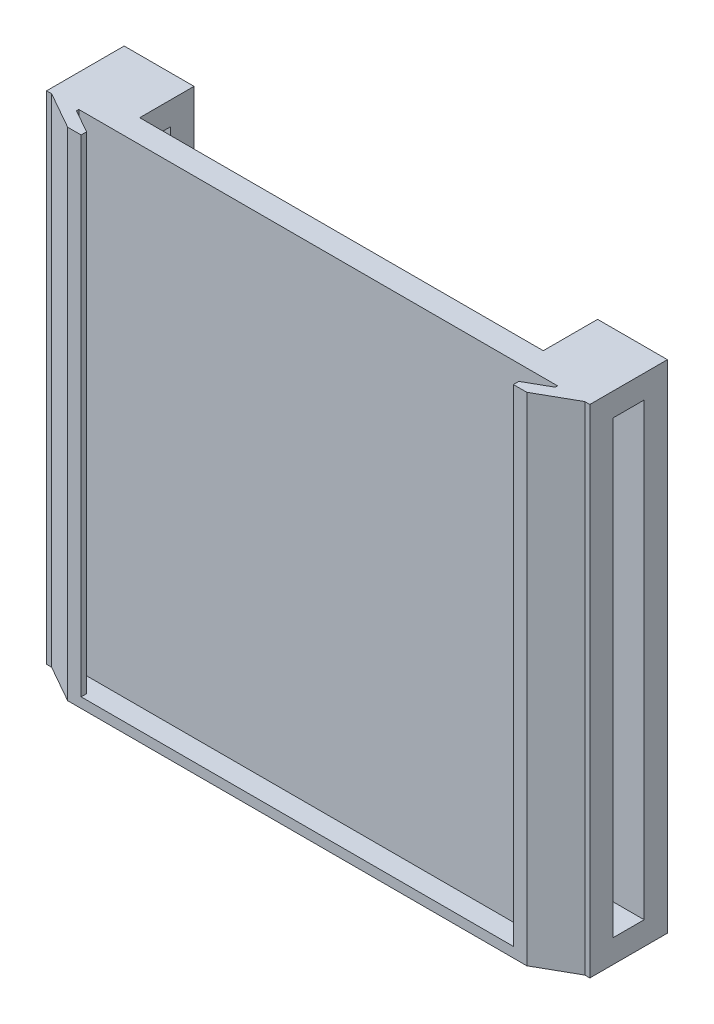
ISO-10303-21;
HEADER;
FILE_DESCRIPTION(('STEP AP214'),'2;1');
FILE_NAME('part.step','',(''),(''),'','','');
FILE_SCHEMA(('AUTOMOTIVE_DESIGN { 1 0 10303 214 1 1 1 1 }'));
ENDSEC;
DATA;
#1=APPLICATION_CONTEXT('core data for automotive mechanical design processes');
#2=APPLICATION_PROTOCOL_DEFINITION('international standard','automotive_design',2000,#1);
#3=PRODUCT_CONTEXT('',#1,'mechanical');
#4=PRODUCT('Part','Part','',(#3));
#5=PRODUCT_RELATED_PRODUCT_CATEGORY('part','',(#4));
#6=PRODUCT_DEFINITION_FORMATION('','',#4);
#7=PRODUCT_DEFINITION_CONTEXT('part definition',#1,'design');
#8=PRODUCT_DEFINITION('design','',#6,#7);
#9=PRODUCT_DEFINITION_SHAPE('','',#8);
#10=(LENGTH_UNIT() NAMED_UNIT(*) SI_UNIT(.MILLI.,.METRE.));
#11=(NAMED_UNIT(*) PLANE_ANGLE_UNIT() SI_UNIT($,.RADIAN.));
#12=(NAMED_UNIT(*) SI_UNIT($,.STERADIAN.) SOLID_ANGLE_UNIT());
#13=UNCERTAINTY_MEASURE_WITH_UNIT(LENGTH_MEASURE(1.E-05),#10,'distance_accuracy_value','');
#14=(GEOMETRIC_REPRESENTATION_CONTEXT(3) GLOBAL_UNCERTAINTY_ASSIGNED_CONTEXT((#13)) GLOBAL_UNIT_ASSIGNED_CONTEXT((#10,
#11,#12)) REPRESENTATION_CONTEXT('',''));
#15=CARTESIAN_POINT('',(0.,0.,0.));
#16=DIRECTION('',(0.,0.,1.));
#17=DIRECTION('',(1.,0.,0.));
#18=AXIS2_PLACEMENT_3D('',#15,#16,#17);
#19=CARTESIAN_POINT('',(0.,0.,0.));
#20=DIRECTION('',(0.,0.,1.));
#21=DIRECTION('',(1.,0.,0.));
#22=AXIS2_PLACEMENT_3D('',#19,#20,#21);
#23=PLANE('',#22);
#24=DIRECTION('',(-1.,0.,0.));
#25=VECTOR('',#24,1.);
#26=CARTESIAN_POINT('',(-35.,32.,0.));
#27=LINE('',#26,#25);
#28=CARTESIAN_POINT('',(-26.,32.,0.));
#29=VERTEX_POINT('',#28);
#30=CARTESIAN_POINT('',(-35.,32.,0.));
#31=VERTEX_POINT('',#30);
#32=EDGE_CURVE('E491',#29,#31,#27,.T.);
#33=ORIENTED_EDGE('',*,*,#32,.F.);
#34=DIRECTION('',(0.,1.,0.));
#35=VECTOR('',#34,1.);
#36=CARTESIAN_POINT('',(-26.,-32.,0.));
#37=LINE('',#36,#35);
#38=CARTESIAN_POINT('',(-26.,-32.,0.));
#39=VERTEX_POINT('',#38);
#40=EDGE_CURVE('E328',#39,#29,#37,.T.);
#41=ORIENTED_EDGE('',*,*,#40,.F.);
#42=DIRECTION('',(1.,0.,0.));
#43=VECTOR('',#42,1.);
#44=CARTESIAN_POINT('',(-35.,-32.,0.));
#45=LINE('',#44,#43);
#46=CARTESIAN_POINT('',(-35.,-32.,0.));
#47=VERTEX_POINT('',#46);
#48=EDGE_CURVE('E484',#47,#39,#45,.T.);
#49=ORIENTED_EDGE('',*,*,#48,.F.);
#50=DIRECTION('',(0.,-1.,0.));
#51=VECTOR('',#50,1.);
#52=CARTESIAN_POINT('',(-35.,32.,0.));
#53=LINE('',#52,#51);
#54=EDGE_CURVE('E446',#31,#47,#53,.T.);
#55=ORIENTED_EDGE('',*,*,#54,.F.);
#56=EDGE_LOOP('',(#33,#41,#49,#55));
#57=FACE_BOUND('',#56,.T.);
#58=ADVANCED_FACE('F43',(#57),#23,.F.);
#59=CARTESIAN_POINT('',(0.,0.,10.));
#60=DIRECTION('',(0.,0.,1.));
#61=DIRECTION('',(1.,0.,0.));
#62=AXIS2_PLACEMENT_3D('',#59,#60,#61);
#63=PLANE('',#62);
#64=DIRECTION('',(1.,0.,0.));
#65=VECTOR('',#64,1.);
#66=CARTESIAN_POINT('',(-35.,-32.,10.));
#67=LINE('',#66,#65);
#68=CARTESIAN_POINT('',(-35.,-32.,10.));
#69=VERTEX_POINT('',#68);
#70=CARTESIAN_POINT('',(-34.34617358,-32.,10.));
#71=VERTEX_POINT('',#70);
#72=EDGE_CURVE('E467',#69,#71,#67,.T.);
#73=ORIENTED_EDGE('',*,*,#72,.T.);
#74=DIRECTION('',(0.,1.,0.));
#75=VECTOR('',#74,1.);
#76=CARTESIAN_POINT('',(-34.34617358,-32.,10.));
#77=LINE('',#76,#75);
#78=CARTESIAN_POINT('',(-34.34617358,32.,10.));
#79=VERTEX_POINT('',#78);
#80=EDGE_CURVE('E396',#71,#79,#77,.T.);
#81=ORIENTED_EDGE('',*,*,#80,.T.);
#82=DIRECTION('',(-1.,0.,0.));
#83=VECTOR('',#82,1.);
#84=CARTESIAN_POINT('',(-35.,32.,10.));
#85=LINE('',#84,#83);
#86=CARTESIAN_POINT('',(-35.,32.,10.));
#87=VERTEX_POINT('',#86);
#88=EDGE_CURVE('E473',#79,#87,#85,.T.);
#89=ORIENTED_EDGE('',*,*,#88,.T.);
#90=DIRECTION('',(0.,-1.,0.));
#91=VECTOR('',#90,1.);
#92=CARTESIAN_POINT('',(-35.,32.,10.));
#93=LINE('',#92,#91);
#94=EDGE_CURVE('E461',#87,#69,#93,.T.);
#95=ORIENTED_EDGE('',*,*,#94,.T.);
#96=EDGE_LOOP('',(#73,#81,#89,#95));
#97=FACE_BOUND('',#96,.T.);
#98=ADVANCED_FACE('F559',(#97),#63,.T.);
#99=DIRECTION('',(1.,0.,0.));
#100=VECTOR('',#99,1.);
#101=CARTESIAN_POINT('',(-30.84617358,-30.7,10.));
#102=LINE('',#101,#100);
#103=CARTESIAN_POINT('',(-30.84617358,-30.7,10.));
#104=VERTEX_POINT('',#103);
#105=CARTESIAN_POINT('',(30.84617358,-30.7,10.));
#106=VERTEX_POINT('',#105);
#107=EDGE_CURVE('E362',#104,#106,#102,.T.);
#108=ORIENTED_EDGE('',*,*,#107,.T.);
#109=DIRECTION('',(0.,1.,0.));
#110=VECTOR('',#109,1.);
#111=CARTESIAN_POINT('',(30.84617358,-32.,10.));
#112=LINE('',#111,#110);
#113=CARTESIAN_POINT('',(30.84617358,32.,10.));
#114=VERTEX_POINT('',#113);
#115=EDGE_CURVE('E456',#106,#114,#112,.T.);
#116=ORIENTED_EDGE('',*,*,#115,.T.);
#117=CARTESIAN_POINT('',(-30.84617358,32.,10.));
#118=VERTEX_POINT('',#117);
#119=EDGE_CURVE('E479',#114,#118,#85,.T.);
#120=ORIENTED_EDGE('',*,*,#119,.T.);
#121=DIRECTION('',(0.,1.,0.));
#122=VECTOR('',#121,1.);
#123=CARTESIAN_POINT('',(-30.84617358,-32.,10.));
#124=LINE('',#123,#122);
#125=EDGE_CURVE('E401',#104,#118,#124,.T.);
#126=ORIENTED_EDGE('',*,*,#125,.F.);
#127=EDGE_LOOP('',(#108,#116,#120,#126));
#128=FACE_BOUND('',#127,.T.);
#129=ADVANCED_FACE('F565',(#128),#63,.T.);
#130=CARTESIAN_POINT('',(-35.,32.,10.));
#131=DIRECTION('',(1.,0.,0.));
#132=DIRECTION('',(0.,1.,0.));
#133=AXIS2_PLACEMENT_3D('',#130,#131,#132);
#134=PLANE('',#133);
#135=DIRECTION('',(0.,0.,-1.));
#136=VECTOR('',#135,1.);
#137=CARTESIAN_POINT('',(-35.,-29.,2.99999999999999));
#138=LINE('',#137,#136);
#139=CARTESIAN_POINT('',(-35.,-29.,6.99999999999999));
#140=VERTEX_POINT('',#139);
#141=CARTESIAN_POINT('',(-35.,-29.,2.99999999999999));
#142=VERTEX_POINT('',#141);
#143=EDGE_CURVE('E255',#140,#142,#138,.T.);
#144=ORIENTED_EDGE('',*,*,#143,.T.);
#145=DIRECTION('',(0.,1.,0.));
#146=VECTOR('',#145,1.);
#147=CARTESIAN_POINT('',(-35.,29.,3.));
#148=LINE('',#147,#146);
#149=CARTESIAN_POINT('',(-35.,29.,3.));
#150=VERTEX_POINT('',#149);
#151=EDGE_CURVE('E236',#142,#150,#148,.T.);
#152=ORIENTED_EDGE('',*,*,#151,.T.);
#153=DIRECTION('',(0.,0.,1.));
#154=VECTOR('',#153,1.);
#155=CARTESIAN_POINT('',(-35.,29.,3.));
#156=LINE('',#155,#154);
#157=CARTESIAN_POINT('',(-35.,29.,7.));
#158=VERTEX_POINT('',#157);
#159=EDGE_CURVE('E247',#150,#158,#156,.T.);
#160=ORIENTED_EDGE('',*,*,#159,.T.);
#161=DIRECTION('',(0.,-1.,0.));
#162=VECTOR('',#161,1.);
#163=CARTESIAN_POINT('',(-35.,29.,7.));
#164=LINE('',#163,#162);
#165=EDGE_CURVE('E59',#158,#140,#164,.T.);
#166=ORIENTED_EDGE('',*,*,#165,.T.);
#167=EDGE_LOOP('',(#144,#152,#160,#166));
#168=FACE_BOUND('',#167,.T.);
#169=ORIENTED_EDGE('',*,*,#54,.T.);
#170=DIRECTION('',(0.,0.,-1.));
#171=VECTOR('',#170,1.);
#172=CARTESIAN_POINT('',(-35.,-32.,10.));
#173=LINE('',#172,#171);
#174=EDGE_CURVE('E52',#69,#47,#173,.T.);
#175=ORIENTED_EDGE('',*,*,#174,.F.);
#176=ORIENTED_EDGE('',*,*,#94,.F.);
#177=DIRECTION('',(0.,0.,-1.));
#178=VECTOR('',#177,1.);
#179=CARTESIAN_POINT('',(-35.,32.,10.));
#180=LINE('',#179,#178);
#181=EDGE_CURVE('E478',#87,#31,#180,.T.);
#182=ORIENTED_EDGE('',*,*,#181,.T.);
#183=EDGE_LOOP('',(#169,#175,#176,#182));
#184=FACE_BOUND('',#183,.T.);
#185=ADVANCED_FACE('F45',(#168,#184),#134,.F.);
#186=CARTESIAN_POINT('',(-35.,-32.,10.));
#187=DIRECTION('',(0.,1.,0.));
#188=DIRECTION('',(0.,0.,1.));
#189=AXIS2_PLACEMENT_3D('',#186,#187,#188);
#190=PLANE('',#189);
#191=ORIENTED_EDGE('',*,*,#48,.T.);
#192=DIRECTION('',(0.,0.,1.));
#193=VECTOR('',#192,1.);
#194=CARTESIAN_POINT('',(-26.,-32.,0.));
#195=LINE('',#194,#193);
#196=CARTESIAN_POINT('',(-26.,-32.,7.));
#197=VERTEX_POINT('',#196);
#198=EDGE_CURVE('E305',#39,#197,#195,.T.);
#199=ORIENTED_EDGE('',*,*,#198,.T.);
#200=DIRECTION('',(1.,0.,0.));
#201=VECTOR('',#200,1.);
#202=CARTESIAN_POINT('',(-26.,-32.,7.));
#203=LINE('',#202,#201);
#204=CARTESIAN_POINT('',(26.,-32.,7.));
#205=VERTEX_POINT('',#204);
#206=EDGE_CURVE('E309',#197,#205,#203,.T.);
#207=ORIENTED_EDGE('',*,*,#206,.T.);
#208=DIRECTION('',(0.,0.,-1.));
#209=VECTOR('',#208,1.);
#210=CARTESIAN_POINT('',(26.,-32.,0.));
#211=LINE('',#210,#209);
#212=CARTESIAN_POINT('',(26.,-32.,0.));
#213=VERTEX_POINT('',#212);
#214=EDGE_CURVE('E314',#205,#213,#211,.T.);
#215=ORIENTED_EDGE('',*,*,#214,.T.);
#216=CARTESIAN_POINT('',(35.,-32.,0.));
#217=VERTEX_POINT('',#216);
#218=EDGE_CURVE('E483',#213,#217,#45,.T.);
#219=ORIENTED_EDGE('',*,*,#218,.T.);
#220=DIRECTION('',(0.,0.,-1.));
#221=VECTOR('',#220,1.);
#222=CARTESIAN_POINT('',(35.,-32.,10.));
#223=LINE('',#222,#221);
#224=CARTESIAN_POINT('',(35.,-32.,10.));
#225=VERTEX_POINT('',#224);
#226=EDGE_CURVE('E502',#225,#217,#223,.T.);
#227=ORIENTED_EDGE('',*,*,#226,.F.);
#228=CARTESIAN_POINT('',(34.34617358,-32.,10.));
#229=VERTEX_POINT('',#228);
#230=EDGE_CURVE('E465',#229,#225,#67,.T.);
#231=ORIENTED_EDGE('',*,*,#230,.F.);
#232=DIRECTION('',(0.870022185848613,0.,-0.49301257198088));
#233=VECTOR('',#232,1.);
#234=CARTESIAN_POINT('',(29.5814676976471,-32.,12.7));
#235=LINE('',#234,#233);
#236=CARTESIAN_POINT('',(29.5814676976471,-32.,12.7));
#237=VERTEX_POINT('',#236);
#238=EDGE_CURVE('E416',#237,#229,#235,.T.);
#239=ORIENTED_EDGE('',*,*,#238,.F.);
#240=DIRECTION('',(1.,0.,0.));
#241=VECTOR('',#240,1.);
#242=CARTESIAN_POINT('',(27.84617358,-32.,12.7));
#243=LINE('',#242,#241);
#244=CARTESIAN_POINT('',(-29.5814676976471,-32.,12.7));
#245=VERTEX_POINT('',#244);
#246=EDGE_CURVE('E419',#245,#237,#243,.T.);
#247=ORIENTED_EDGE('',*,*,#246,.F.);
#248=DIRECTION('',(-0.870022185848613,0.,-0.49301257198088));
#249=VECTOR('',#248,1.);
#250=CARTESIAN_POINT('',(-29.5814676976471,-32.,12.7));
#251=LINE('',#250,#249);
#252=EDGE_CURVE('E373',#245,#71,#251,.T.);
#253=ORIENTED_EDGE('',*,*,#252,.T.);
#254=ORIENTED_EDGE('',*,*,#72,.F.);
#255=ORIENTED_EDGE('',*,*,#174,.T.);
#256=EDGE_LOOP('',(#191,#199,#207,#215,#219,#227,#231,#239,#247,#253,#254,#255));
#257=FACE_BOUND('',#256,.T.);
#258=ADVANCED_FACE('F509',(#257),#190,.F.);
#259=CARTESIAN_POINT('',(35.,32.,10.));
#260=DIRECTION('',(-1.,0.,0.));
#261=DIRECTION('',(0.,-1.,0.));
#262=AXIS2_PLACEMENT_3D('',#259,#260,#261);
#263=PLANE('',#262);
#264=DIRECTION('',(0.,0.,1.));
#265=VECTOR('',#264,1.);
#266=CARTESIAN_POINT('',(35.,29.,3.));
#267=LINE('',#266,#265);
#268=CARTESIAN_POINT('',(35.,29.,3.));
#269=VERTEX_POINT('',#268);
#270=CARTESIAN_POINT('',(35.,29.,7.));
#271=VERTEX_POINT('',#270);
#272=EDGE_CURVE('E270',#269,#271,#267,.T.);
#273=ORIENTED_EDGE('',*,*,#272,.F.);
#274=DIRECTION('',(0.,1.,0.));
#275=VECTOR('',#274,1.);
#276=CARTESIAN_POINT('',(35.,29.,3.));
#277=LINE('',#276,#275);
#278=CARTESIAN_POINT('',(35.,-29.,2.99999999999999));
#279=VERTEX_POINT('',#278);
#280=EDGE_CURVE('E67',#279,#269,#277,.T.);
#281=ORIENTED_EDGE('',*,*,#280,.F.);
#282=DIRECTION('',(0.,0.,-1.));
#283=VECTOR('',#282,1.);
#284=CARTESIAN_POINT('',(35.,-29.,2.99999999999999));
#285=LINE('',#284,#283);
#286=CARTESIAN_POINT('',(35.,-29.,6.99999999999999));
#287=VERTEX_POINT('',#286);
#288=EDGE_CURVE('E257',#287,#279,#285,.T.);
#289=ORIENTED_EDGE('',*,*,#288,.F.);
#290=DIRECTION('',(0.,-1.,0.));
#291=VECTOR('',#290,1.);
#292=CARTESIAN_POINT('',(35.,29.,7.));
#293=LINE('',#292,#291);
#294=EDGE_CURVE('E261',#271,#287,#293,.T.);
#295=ORIENTED_EDGE('',*,*,#294,.F.);
#296=EDGE_LOOP('',(#273,#281,#289,#295));
#297=FACE_BOUND('',#296,.T.);
#298=DIRECTION('',(0.,1.,0.));
#299=VECTOR('',#298,1.);
#300=CARTESIAN_POINT('',(35.,32.,0.));
#301=LINE('',#300,#299);
#302=CARTESIAN_POINT('',(35.,32.,0.));
#303=VERTEX_POINT('',#302);
#304=EDGE_CURVE('E488',#217,#303,#301,.T.);
#305=ORIENTED_EDGE('',*,*,#304,.T.);
#306=DIRECTION('',(0.,0.,-1.));
#307=VECTOR('',#306,1.);
#308=CARTESIAN_POINT('',(35.,32.,10.));
#309=LINE('',#308,#307);
#310=CARTESIAN_POINT('',(35.,32.,10.));
#311=VERTEX_POINT('',#310);
#312=EDGE_CURVE('E498',#311,#303,#309,.T.);
#313=ORIENTED_EDGE('',*,*,#312,.F.);
#314=DIRECTION('',(0.,1.,0.));
#315=VECTOR('',#314,1.);
#316=CARTESIAN_POINT('',(35.,32.,10.));
#317=LINE('',#316,#315);
#318=EDGE_CURVE('E470',#225,#311,#317,.T.);
#319=ORIENTED_EDGE('',*,*,#318,.F.);
#320=ORIENTED_EDGE('',*,*,#226,.T.);
#321=EDGE_LOOP('',(#305,#313,#319,#320));
#322=FACE_BOUND('',#321,.T.);
#323=ADVANCED_FACE('F537',(#297,#322),#263,.F.);
#324=CARTESIAN_POINT('',(-35.,32.,10.));
#325=DIRECTION('',(0.,-1.,0.));
#326=DIRECTION('',(0.,0.,-1.));
#327=AXIS2_PLACEMENT_3D('',#324,#325,#326);
#328=PLANE('',#327);
#329=DIRECTION('',(1.,0.,0.));
#330=VECTOR('',#329,1.);
#331=CARTESIAN_POINT('',(-26.,32.,7.));
#332=LINE('',#331,#330);
#333=CARTESIAN_POINT('',(-26.,32.,7.));
#334=VERTEX_POINT('',#333);
#335=CARTESIAN_POINT('',(26.,32.,7.));
#336=VERTEX_POINT('',#335);
#337=EDGE_CURVE('E322',#334,#336,#332,.T.);
#338=ORIENTED_EDGE('',*,*,#337,.F.);
#339=DIRECTION('',(0.,0.,1.));
#340=VECTOR('',#339,1.);
#341=CARTESIAN_POINT('',(-26.,32.,0.));
#342=LINE('',#341,#340);
#343=EDGE_CURVE('E304',#29,#334,#342,.T.);
#344=ORIENTED_EDGE('',*,*,#343,.F.);
#345=ORIENTED_EDGE('',*,*,#32,.T.);
#346=ORIENTED_EDGE('',*,*,#181,.F.);
#347=ORIENTED_EDGE('',*,*,#88,.F.);
#348=DIRECTION('',(-0.870022185848613,0.,-0.49301257198088));
#349=VECTOR('',#348,1.);
#350=CARTESIAN_POINT('',(-29.5814676976471,32.,12.7));
#351=LINE('',#350,#349);
#352=CARTESIAN_POINT('',(-29.5814676976471,32.,12.7));
#353=VERTEX_POINT('',#352);
#354=EDGE_CURVE('E372',#353,#79,#351,.T.);
#355=ORIENTED_EDGE('',*,*,#354,.F.);
#356=DIRECTION('',(-1.,0.,0.));
#357=VECTOR('',#356,1.);
#358=CARTESIAN_POINT('',(-27.84617358,32.,12.7));
#359=LINE('',#358,#357);
#360=CARTESIAN_POINT('',(-27.84617358,32.,12.7));
#361=VERTEX_POINT('',#360);
#362=EDGE_CURVE('E382',#361,#353,#359,.T.);
#363=ORIENTED_EDGE('',*,*,#362,.F.);
#364=DIRECTION('',(0.,0.,1.));
#365=VECTOR('',#364,1.);
#366=CARTESIAN_POINT('',(-27.84617358,32.,12.));
#367=LINE('',#366,#365);
#368=CARTESIAN_POINT('',(-27.84617358,32.,12.));
#369=VERTEX_POINT('',#368);
#370=EDGE_CURVE('E385',#369,#361,#367,.T.);
#371=ORIENTED_EDGE('',*,*,#370,.F.);
#372=DIRECTION('',(0.870022185848612,0.,0.49301257198088));
#373=VECTOR('',#372,1.);
#374=CARTESIAN_POINT('',(-27.84617358,32.,12.));
#375=LINE('',#374,#373);
#376=CARTESIAN_POINT('',(-30.84617358,32.,10.3));
#377=VERTEX_POINT('',#376);
#378=EDGE_CURVE('E389',#377,#369,#375,.T.);
#379=ORIENTED_EDGE('',*,*,#378,.F.);
#380=DIRECTION('',(0.,0.,1.));
#381=VECTOR('',#380,1.);
#382=CARTESIAN_POINT('',(-30.84617358,32.,10.3));
#383=LINE('',#382,#381);
#384=EDGE_CURVE('E378',#118,#377,#383,.T.);
#385=ORIENTED_EDGE('',*,*,#384,.F.);
#386=ORIENTED_EDGE('',*,*,#119,.F.);
#387=DIRECTION('',(0.,0.,1.));
#388=VECTOR('',#387,1.);
#389=CARTESIAN_POINT('',(30.84617358,32.,10.3));
#390=LINE('',#389,#388);
#391=CARTESIAN_POINT('',(30.84617358,32.,10.3));
#392=VERTEX_POINT('',#391);
#393=EDGE_CURVE('E428',#114,#392,#390,.T.);
#394=ORIENTED_EDGE('',*,*,#393,.T.);
#395=DIRECTION('',(-0.870022185848612,0.,0.49301257198088));
#396=VECTOR('',#395,1.);
#397=CARTESIAN_POINT('',(27.84617358,32.,12.));
#398=LINE('',#397,#396);
#399=CARTESIAN_POINT('',(27.84617358,32.,12.));
#400=VERTEX_POINT('',#399);
#401=EDGE_CURVE('E432',#392,#400,#398,.T.);
#402=ORIENTED_EDGE('',*,*,#401,.T.);
#403=DIRECTION('',(0.,0.,1.));
#404=VECTOR('',#403,1.);
#405=CARTESIAN_POINT('',(27.84617358,32.,12.));
#406=LINE('',#405,#404);
#407=CARTESIAN_POINT('',(27.84617358,32.,12.7));
#408=VERTEX_POINT('',#407);
#409=EDGE_CURVE('E436',#400,#408,#406,.T.);
#410=ORIENTED_EDGE('',*,*,#409,.T.);
#411=DIRECTION('',(1.,0.,0.));
#412=VECTOR('',#411,1.);
#413=CARTESIAN_POINT('',(27.84617358,32.,12.7));
#414=LINE('',#413,#412);
#415=CARTESIAN_POINT('',(29.5814676976471,32.,12.7));
#416=VERTEX_POINT('',#415);
#417=EDGE_CURVE('E420',#408,#416,#414,.T.);
#418=ORIENTED_EDGE('',*,*,#417,.T.);
#419=DIRECTION('',(0.870022185848613,0.,-0.49301257198088));
#420=VECTOR('',#419,1.);
#421=CARTESIAN_POINT('',(29.5814676976471,32.,12.7));
#422=LINE('',#421,#420);
#423=CARTESIAN_POINT('',(34.34617358,32.,10.));
#424=VERTEX_POINT('',#423);
#425=EDGE_CURVE('E400',#416,#424,#422,.T.);
#426=ORIENTED_EDGE('',*,*,#425,.T.);
#427=EDGE_CURVE('E474',#311,#424,#85,.T.);
#428=ORIENTED_EDGE('',*,*,#427,.F.);
#429=ORIENTED_EDGE('',*,*,#312,.T.);
#430=CARTESIAN_POINT('',(26.,32.,0.));
#431=VERTEX_POINT('',#430);
#432=EDGE_CURVE('E466',#303,#431,#27,.T.);
#433=ORIENTED_EDGE('',*,*,#432,.T.);
#434=DIRECTION('',(0.,0.,-1.));
#435=VECTOR('',#434,1.);
#436=CARTESIAN_POINT('',(26.,32.,0.));
#437=LINE('',#436,#435);
#438=EDGE_CURVE('E310',#336,#431,#437,.T.);
#439=ORIENTED_EDGE('',*,*,#438,.F.);
#440=EDGE_LOOP('',(#338,#344,#345,#346,#347,#355,#363,#371,#379,#385,#386,#394,#402,#410,#418,
#426,#428,#429,#433,#439));
#441=FACE_BOUND('',#440,.T.);
#442=ADVANCED_FACE('F522',(#441),#328,.F.);
#443=DIRECTION('',(0.,1.,0.));
#444=VECTOR('',#443,1.);
#445=CARTESIAN_POINT('',(34.34617358,-32.,10.));
#446=LINE('',#445,#444);
#447=EDGE_CURVE('E424',#229,#424,#446,.T.);
#448=ORIENTED_EDGE('',*,*,#447,.F.);
#449=ORIENTED_EDGE('',*,*,#230,.T.);
#450=ORIENTED_EDGE('',*,*,#318,.T.);
#451=ORIENTED_EDGE('',*,*,#427,.T.);
#452=EDGE_LOOP('',(#448,#449,#450,#451));
#453=FACE_BOUND('',#452,.T.);
#454=ADVANCED_FACE('F568',(#453),#63,.T.);
#455=ORIENTED_EDGE('',*,*,#218,.F.);
#456=DIRECTION('',(0.,1.,0.));
#457=VECTOR('',#456,1.);
#458=CARTESIAN_POINT('',(26.,-32.,0.));
#459=LINE('',#458,#457);
#460=EDGE_CURVE('E332',#213,#431,#459,.T.);
#461=ORIENTED_EDGE('',*,*,#460,.T.);
#462=ORIENTED_EDGE('',*,*,#432,.F.);
#463=ORIENTED_EDGE('',*,*,#304,.F.);
#464=EDGE_LOOP('',(#455,#461,#462,#463));
#465=FACE_BOUND('',#464,.T.);
#466=ADVANCED_FACE('F561',(#465),#23,.F.);
#467=CARTESIAN_POINT('',(29.5814676976471,-32.,12.7));
#468=DIRECTION('',(0.49301257198088,0.,0.870022185848613));
#469=DIRECTION('',(0.870022185848613,0.,-0.49301257198088));
#470=AXIS2_PLACEMENT_3D('',#467,#468,#469);
#471=PLANE('',#470);
#472=ORIENTED_EDGE('',*,*,#425,.F.);
#473=DIRECTION('',(0.,1.,0.));
#474=VECTOR('',#473,1.);
#475=CARTESIAN_POINT('',(29.5814676976471,-32.,12.7));
#476=LINE('',#475,#474);
#477=EDGE_CURVE('E443',#237,#416,#476,.T.);
#478=ORIENTED_EDGE('',*,*,#477,.F.);
#479=ORIENTED_EDGE('',*,*,#238,.T.);
#480=ORIENTED_EDGE('',*,*,#447,.T.);
#481=EDGE_LOOP('',(#472,#478,#479,#480));
#482=FACE_BOUND('',#481,.T.);
#483=ADVANCED_FACE('F571',(#482),#471,.T.);
#484=CARTESIAN_POINT('',(27.84617358,-32.,12.7));
#485=DIRECTION('',(0.,0.,1.));
#486=DIRECTION('',(1.,0.,0.));
#487=AXIS2_PLACEMENT_3D('',#484,#485,#486);
#488=PLANE('',#487);
#489=ORIENTED_EDGE('',*,*,#417,.F.);
#490=DIRECTION('',(0.,1.,0.));
#491=VECTOR('',#490,1.);
#492=CARTESIAN_POINT('',(27.84617358,-32.,12.7));
#493=LINE('',#492,#491);
#494=CARTESIAN_POINT('',(27.84617358,-30.7,12.7));
#495=VERTEX_POINT('',#494);
#496=EDGE_CURVE('E447',#495,#408,#493,.T.);
#497=ORIENTED_EDGE('',*,*,#496,.F.);
#498=DIRECTION('',(1.,0.,0.));
#499=VECTOR('',#498,1.);
#500=CARTESIAN_POINT('',(-27.84617358,-30.7,12.7));
#501=LINE('',#500,#499);
#502=CARTESIAN_POINT('',(-27.84617358,-30.7,12.7));
#503=VERTEX_POINT('',#502);
#504=EDGE_CURVE('E347',#503,#495,#501,.T.);
#505=ORIENTED_EDGE('',*,*,#504,.F.);
#506=DIRECTION('',(0.,1.,0.));
#507=VECTOR('',#506,1.);
#508=CARTESIAN_POINT('',(-27.84617358,-32.,12.7));
#509=LINE('',#508,#507);
#510=EDGE_CURVE('E410',#503,#361,#509,.T.);
#511=ORIENTED_EDGE('',*,*,#510,.T.);
#512=ORIENTED_EDGE('',*,*,#362,.T.);
#513=DIRECTION('',(0.,1.,0.));
#514=VECTOR('',#513,1.);
#515=CARTESIAN_POINT('',(-29.5814676976471,-32.,12.7));
#516=LINE('',#515,#514);
#517=EDGE_CURVE('E377',#245,#353,#516,.T.);
#518=ORIENTED_EDGE('',*,*,#517,.F.);
#519=ORIENTED_EDGE('',*,*,#246,.T.);
#520=ORIENTED_EDGE('',*,*,#477,.T.);
#521=EDGE_LOOP('',(#489,#497,#505,#511,#512,#518,#519,#520));
#522=FACE_BOUND('',#521,.T.);
#523=ADVANCED_FACE('F577',(#522),#488,.T.);
#524=CARTESIAN_POINT('',(27.84617358,-32.,12.));
#525=DIRECTION('',(-1.,0.,0.));
#526=DIRECTION('',(0.,0.,1.));
#527=AXIS2_PLACEMENT_3D('',#524,#525,#526);
#528=PLANE('',#527);
#529=DIRECTION('',(0.,0.,1.));
#530=VECTOR('',#529,1.);
#531=CARTESIAN_POINT('',(27.84617358,-30.7,12.));
#532=LINE('',#531,#530);
#533=CARTESIAN_POINT('',(27.84617358,-30.7,12.));
#534=VERTEX_POINT('',#533);
#535=EDGE_CURVE('E350',#534,#495,#532,.T.);
#536=ORIENTED_EDGE('',*,*,#535,.T.);
#537=ORIENTED_EDGE('',*,*,#496,.T.);
#538=ORIENTED_EDGE('',*,*,#409,.F.);
#539=DIRECTION('',(0.,1.,0.));
#540=VECTOR('',#539,1.);
#541=CARTESIAN_POINT('',(27.84617358,-32.,12.));
#542=LINE('',#541,#540);
#543=EDGE_CURVE('E450',#534,#400,#542,.T.);
#544=ORIENTED_EDGE('',*,*,#543,.F.);
#545=EDGE_LOOP('',(#536,#537,#538,#544));
#546=FACE_BOUND('',#545,.T.);
#547=ADVANCED_FACE('F620',(#546),#528,.T.);
#548=CARTESIAN_POINT('',(27.84617358,-32.,12.));
#549=DIRECTION('',(-0.493012571980881,0.,-0.870022185848612));
#550=DIRECTION('',(-0.870022185848612,0.,0.49301257198088));
#551=AXIS2_PLACEMENT_3D('',#548,#549,#550);
#552=PLANE('',#551);
#553=DIRECTION('',(-0.870022185848612,0.,0.49301257198088));
#554=VECTOR('',#553,1.);
#555=CARTESIAN_POINT('',(30.84617358,-30.7,10.3));
#556=LINE('',#555,#554);
#557=CARTESIAN_POINT('',(30.84617358,-30.7,10.3));
#558=VERTEX_POINT('',#557);
#559=EDGE_CURVE('E354',#558,#534,#556,.T.);
#560=ORIENTED_EDGE('',*,*,#559,.T.);
#561=ORIENTED_EDGE('',*,*,#543,.T.);
#562=ORIENTED_EDGE('',*,*,#401,.F.);
#563=DIRECTION('',(0.,1.,0.));
#564=VECTOR('',#563,1.);
#565=CARTESIAN_POINT('',(30.84617358,-32.,10.3));
#566=LINE('',#565,#564);
#567=EDGE_CURVE('E453',#558,#392,#566,.T.);
#568=ORIENTED_EDGE('',*,*,#567,.F.);
#569=EDGE_LOOP('',(#560,#561,#562,#568));
#570=FACE_BOUND('',#569,.T.);
#571=ADVANCED_FACE('F625',(#570),#552,.T.);
#572=CARTESIAN_POINT('',(30.84617358,-32.,10.3));
#573=DIRECTION('',(-1.,0.,0.));
#574=DIRECTION('',(0.,0.,1.));
#575=AXIS2_PLACEMENT_3D('',#572,#573,#574);
#576=PLANE('',#575);
#577=DIRECTION('',(0.,0.,1.));
#578=VECTOR('',#577,1.);
#579=CARTESIAN_POINT('',(30.84617358,-30.7,10.));
#580=LINE('',#579,#578);
#581=EDGE_CURVE('E358',#106,#558,#580,.T.);
#582=ORIENTED_EDGE('',*,*,#581,.T.);
#583=ORIENTED_EDGE('',*,*,#567,.T.);
#584=ORIENTED_EDGE('',*,*,#393,.F.);
#585=ORIENTED_EDGE('',*,*,#115,.F.);
#586=EDGE_LOOP('',(#582,#583,#584,#585));
#587=FACE_BOUND('',#586,.T.);
#588=ADVANCED_FACE('F627',(#587),#576,.T.);
#589=CARTESIAN_POINT('',(-29.5814676976471,-32.,12.7));
#590=DIRECTION('',(0.49301257198088,0.,-0.870022185848613));
#591=DIRECTION('',(-0.870022185848613,0.,-0.49301257198088));
#592=AXIS2_PLACEMENT_3D('',#589,#590,#591);
#593=PLANE('',#592);
#594=ORIENTED_EDGE('',*,*,#354,.T.);
#595=ORIENTED_EDGE('',*,*,#80,.F.);
#596=ORIENTED_EDGE('',*,*,#252,.F.);
#597=ORIENTED_EDGE('',*,*,#517,.T.);
#598=EDGE_LOOP('',(#594,#595,#596,#597));
#599=FACE_BOUND('',#598,.T.);
#600=ADVANCED_FACE('F629',(#599),#593,.F.);
#601=CARTESIAN_POINT('',(-30.84617358,-32.,10.3));
#602=DIRECTION('',(-1.,0.,0.));
#603=DIRECTION('',(0.,-1.,0.));
#604=AXIS2_PLACEMENT_3D('',#601,#602,#603);
#605=PLANE('',#604);
#606=DIRECTION('',(0.,1.,0.));
#607=VECTOR('',#606,1.);
#608=CARTESIAN_POINT('',(-30.84617358,-32.,10.3));
#609=LINE('',#608,#607);
#610=CARTESIAN_POINT('',(-30.84617358,-30.7,10.3));
#611=VERTEX_POINT('',#610);
#612=EDGE_CURVE('E404',#611,#377,#609,.T.);
#613=ORIENTED_EDGE('',*,*,#612,.F.);
#614=DIRECTION('',(0.,0.,1.));
#615=VECTOR('',#614,1.);
#616=CARTESIAN_POINT('',(-30.84617358,-30.7,10.));
#617=LINE('',#616,#615);
#618=EDGE_CURVE('E366',#104,#611,#617,.T.);
#619=ORIENTED_EDGE('',*,*,#618,.F.);
#620=ORIENTED_EDGE('',*,*,#125,.T.);
#621=ORIENTED_EDGE('',*,*,#384,.T.);
#622=EDGE_LOOP('',(#613,#619,#620,#621));
#623=FACE_BOUND('',#622,.T.);
#624=ADVANCED_FACE('F601',(#623),#605,.F.);
#625=CARTESIAN_POINT('',(-27.84617358,-32.,12.));
#626=DIRECTION('',(-0.49301257198088,0.,0.870022185848612));
#627=DIRECTION('',(0.870022185848612,0.,0.493012571980881));
#628=AXIS2_PLACEMENT_3D('',#625,#626,#627);
#629=PLANE('',#628);
#630=DIRECTION('',(0.,1.,0.));
#631=VECTOR('',#630,1.);
#632=CARTESIAN_POINT('',(-27.84617358,-32.,12.));
#633=LINE('',#632,#631);
#634=CARTESIAN_POINT('',(-27.84617358,-30.7,12.));
#635=VERTEX_POINT('',#634);
#636=EDGE_CURVE('E407',#635,#369,#633,.T.);
#637=ORIENTED_EDGE('',*,*,#636,.F.);
#638=DIRECTION('',(0.870022185848612,0.,0.49301257198088));
#639=VECTOR('',#638,1.);
#640=CARTESIAN_POINT('',(-30.84617358,-30.7,10.3));
#641=LINE('',#640,#639);
#642=EDGE_CURVE('E369',#611,#635,#641,.T.);
#643=ORIENTED_EDGE('',*,*,#642,.F.);
#644=ORIENTED_EDGE('',*,*,#612,.T.);
#645=ORIENTED_EDGE('',*,*,#378,.T.);
#646=EDGE_LOOP('',(#637,#643,#644,#645));
#647=FACE_BOUND('',#646,.T.);
#648=ADVANCED_FACE('F609',(#647),#629,.F.);
#649=CARTESIAN_POINT('',(-27.84617358,-32.,12.));
#650=DIRECTION('',(-1.,0.,0.));
#651=DIRECTION('',(0.,-1.,0.));
#652=AXIS2_PLACEMENT_3D('',#649,#650,#651);
#653=PLANE('',#652);
#654=ORIENTED_EDGE('',*,*,#510,.F.);
#655=DIRECTION('',(0.,0.,1.));
#656=VECTOR('',#655,1.);
#657=CARTESIAN_POINT('',(-27.84617358,-30.7,12.));
#658=LINE('',#657,#656);
#659=EDGE_CURVE('E331',#635,#503,#658,.T.);
#660=ORIENTED_EDGE('',*,*,#659,.F.);
#661=ORIENTED_EDGE('',*,*,#636,.T.);
#662=ORIENTED_EDGE('',*,*,#370,.T.);
#663=EDGE_LOOP('',(#654,#660,#661,#662));
#664=FACE_BOUND('',#663,.T.);
#665=ADVANCED_FACE('F612',(#664),#653,.F.);
#666=CARTESIAN_POINT('',(0.,-30.7,0.));
#667=DIRECTION('',(0.,1.,0.));
#668=DIRECTION('',(0.,0.,1.));
#669=AXIS2_PLACEMENT_3D('',#666,#667,#668);
#670=PLANE('',#669);
#671=ORIENTED_EDGE('',*,*,#659,.T.);
#672=ORIENTED_EDGE('',*,*,#504,.T.);
#673=ORIENTED_EDGE('',*,*,#535,.F.);
#674=ORIENTED_EDGE('',*,*,#559,.F.);
#675=ORIENTED_EDGE('',*,*,#581,.F.);
#676=ORIENTED_EDGE('',*,*,#107,.F.);
#677=ORIENTED_EDGE('',*,*,#618,.T.);
#678=ORIENTED_EDGE('',*,*,#642,.T.);
#679=EDGE_LOOP('',(#671,#672,#673,#674,#675,#676,#677,#678));
#680=FACE_BOUND('',#679,.T.);
#681=ADVANCED_FACE('F605',(#680),#670,.T.);
#682=CARTESIAN_POINT('',(-26.,-32.,0.));
#683=DIRECTION('',(-1.,0.,0.));
#684=DIRECTION('',(0.,0.,1.));
#685=AXIS2_PLACEMENT_3D('',#682,#683,#684);
#686=PLANE('',#685);
#687=DIRECTION('',(0.,-1.,0.));
#688=VECTOR('',#687,1.);
#689=CARTESIAN_POINT('',(-26.,-32.,2.99999999999999));
#690=LINE('',#689,#688);
#691=CARTESIAN_POINT('',(-26.,29.,3.));
#692=VERTEX_POINT('',#691);
#693=CARTESIAN_POINT('',(-26.,-29.,2.99999999999999));
#694=VERTEX_POINT('',#693);
#695=EDGE_CURVE('E239',#692,#694,#690,.T.);
#696=ORIENTED_EDGE('',*,*,#695,.T.);
#697=DIRECTION('',(0.,0.,1.));
#698=VECTOR('',#697,1.);
#699=CARTESIAN_POINT('',(-26.,-29.,0.));
#700=LINE('',#699,#698);
#701=CARTESIAN_POINT('',(-26.,-29.,6.99999999999999));
#702=VERTEX_POINT('',#701);
#703=EDGE_CURVE('E298',#694,#702,#700,.T.);
#704=ORIENTED_EDGE('',*,*,#703,.T.);
#705=DIRECTION('',(0.,1.,0.));
#706=VECTOR('',#705,1.);
#707=CARTESIAN_POINT('',(-26.,-32.,7.));
#708=LINE('',#707,#706);
#709=EDGE_CURVE('E341',#197,#702,#708,.T.);
#710=ORIENTED_EDGE('',*,*,#709,.F.);
#711=ORIENTED_EDGE('',*,*,#198,.F.);
#712=ORIENTED_EDGE('',*,*,#40,.T.);
#713=ORIENTED_EDGE('',*,*,#343,.T.);
#714=CARTESIAN_POINT('',(-26.,29.,7.));
#715=VERTEX_POINT('',#714);
#716=EDGE_CURVE('E318',#715,#334,#708,.T.);
#717=ORIENTED_EDGE('',*,*,#716,.F.);
#718=DIRECTION('',(0.,0.,-1.));
#719=VECTOR('',#718,1.);
#720=CARTESIAN_POINT('',(-26.,29.,0.));
#721=LINE('',#720,#719);
#722=EDGE_CURVE('E291',#715,#692,#721,.T.);
#723=ORIENTED_EDGE('',*,*,#722,.T.);
#724=EDGE_LOOP('',(#696,#704,#710,#711,#712,#713,#717,#723));
#725=FACE_BOUND('',#724,.T.);
#726=ADVANCED_FACE('F518',(#725),#686,.F.);
#727=CARTESIAN_POINT('',(26.,-32.,0.));
#728=DIRECTION('',(1.,0.,0.));
#729=DIRECTION('',(0.,0.,-1.));
#730=AXIS2_PLACEMENT_3D('',#727,#728,#729);
#731=PLANE('',#730);
#732=DIRECTION('',(0.,1.,0.));
#733=VECTOR('',#732,1.);
#734=CARTESIAN_POINT('',(26.,-32.,7.));
#735=LINE('',#734,#733);
#736=CARTESIAN_POINT('',(26.,-29.,6.99999999999999));
#737=VERTEX_POINT('',#736);
#738=EDGE_CURVE('E336',#205,#737,#735,.T.);
#739=ORIENTED_EDGE('',*,*,#738,.T.);
#740=DIRECTION('',(0.,0.,-1.));
#741=VECTOR('',#740,1.);
#742=CARTESIAN_POINT('',(26.,-29.,0.));
#743=LINE('',#742,#741);
#744=CARTESIAN_POINT('',(26.,-29.,2.99999999999999));
#745=VERTEX_POINT('',#744);
#746=EDGE_CURVE('E294',#737,#745,#743,.T.);
#747=ORIENTED_EDGE('',*,*,#746,.T.);
#748=DIRECTION('',(0.,1.,0.));
#749=VECTOR('',#748,1.);
#750=CARTESIAN_POINT('',(26.,-32.,2.99999999999999));
#751=LINE('',#750,#749);
#752=CARTESIAN_POINT('',(26.,29.,3.));
#753=VERTEX_POINT('',#752);
#754=EDGE_CURVE('E11',#745,#753,#751,.T.);
#755=ORIENTED_EDGE('',*,*,#754,.T.);
#756=DIRECTION('',(0.,0.,1.));
#757=VECTOR('',#756,1.);
#758=CARTESIAN_POINT('',(26.,29.,0.));
#759=LINE('',#758,#757);
#760=CARTESIAN_POINT('',(26.,29.,7.));
#761=VERTEX_POINT('',#760);
#762=EDGE_CURVE('E280',#753,#761,#759,.T.);
#763=ORIENTED_EDGE('',*,*,#762,.T.);
#764=EDGE_CURVE('E340',#761,#336,#735,.T.);
#765=ORIENTED_EDGE('',*,*,#764,.T.);
#766=ORIENTED_EDGE('',*,*,#438,.T.);
#767=ORIENTED_EDGE('',*,*,#460,.F.);
#768=ORIENTED_EDGE('',*,*,#214,.F.);
#769=EDGE_LOOP('',(#739,#747,#755,#763,#765,#766,#767,#768));
#770=FACE_BOUND('',#769,.T.);
#771=ADVANCED_FACE('F542',(#770),#731,.F.);
#772=CARTESIAN_POINT('',(-26.,-32.,7.));
#773=DIRECTION('',(0.,0.,1.));
#774=DIRECTION('',(1.,0.,0.));
#775=AXIS2_PLACEMENT_3D('',#772,#773,#774);
#776=PLANE('',#775);
#777=ORIENTED_EDGE('',*,*,#764,.F.);
#778=DIRECTION('',(1.,0.,0.));
#779=VECTOR('',#778,1.);
#780=CARTESIAN_POINT('',(-35.,29.,7.));
#781=LINE('',#780,#779);
#782=EDGE_CURVE('E243',#761,#271,#781,.T.);
#783=ORIENTED_EDGE('',*,*,#782,.T.);
#784=ORIENTED_EDGE('',*,*,#294,.T.);
#785=DIRECTION('',(1.,0.,0.));
#786=VECTOR('',#785,1.);
#787=CARTESIAN_POINT('',(-35.,-29.,6.99999999999999));
#788=LINE('',#787,#786);
#789=EDGE_CURVE('E285',#737,#287,#788,.T.);
#790=ORIENTED_EDGE('',*,*,#789,.F.);
#791=ORIENTED_EDGE('',*,*,#738,.F.);
#792=ORIENTED_EDGE('',*,*,#206,.F.);
#793=ORIENTED_EDGE('',*,*,#709,.T.);
#794=EDGE_CURVE('E282',#140,#702,#788,.T.);
#795=ORIENTED_EDGE('',*,*,#794,.F.);
#796=ORIENTED_EDGE('',*,*,#165,.F.);
#797=EDGE_CURVE('E249',#158,#715,#781,.T.);
#798=ORIENTED_EDGE('',*,*,#797,.T.);
#799=ORIENTED_EDGE('',*,*,#716,.T.);
#800=ORIENTED_EDGE('',*,*,#337,.T.);
#801=EDGE_LOOP('',(#777,#783,#784,#790,#791,#792,#793,#795,#796,#798,#799,#800));
#802=FACE_BOUND('',#801,.T.);
#803=ADVANCED_FACE('F525',(#802),#776,.F.);
#804=CARTESIAN_POINT('',(-35.,29.,3.));
#805=DIRECTION('',(0.,1.,0.));
#806=DIRECTION('',(-1.,0.,0.));
#807=AXIS2_PLACEMENT_3D('',#804,#805,#806);
#808=PLANE('',#807);
#809=DIRECTION('',(1.,0.,0.));
#810=VECTOR('',#809,1.);
#811=CARTESIAN_POINT('',(-35.,29.,3.));
#812=LINE('',#811,#810);
#813=EDGE_CURVE('E244',#753,#269,#812,.T.);
#814=ORIENTED_EDGE('',*,*,#813,.T.);
#815=ORIENTED_EDGE('',*,*,#272,.T.);
#816=ORIENTED_EDGE('',*,*,#782,.F.);
#817=ORIENTED_EDGE('',*,*,#762,.F.);
#818=EDGE_LOOP('',(#814,#815,#816,#817));
#819=FACE_BOUND('',#818,.T.);
#820=ADVANCED_FACE('F534',(#819),#808,.F.);
#821=CARTESIAN_POINT('',(-35.,-29.,2.99999999999999));
#822=DIRECTION('',(0.,-1.,0.));
#823=DIRECTION('',(1.,0.,0.));
#824=AXIS2_PLACEMENT_3D('',#821,#822,#823);
#825=PLANE('',#824);
#826=ORIENTED_EDGE('',*,*,#789,.T.);
#827=ORIENTED_EDGE('',*,*,#288,.T.);
#828=DIRECTION('',(1.,0.,0.));
#829=VECTOR('',#828,1.);
#830=CARTESIAN_POINT('',(-35.,-29.,2.99999999999999));
#831=LINE('',#830,#829);
#832=EDGE_CURVE('E281',#745,#279,#831,.T.);
#833=ORIENTED_EDGE('',*,*,#832,.F.);
#834=ORIENTED_EDGE('',*,*,#746,.F.);
#835=EDGE_LOOP('',(#826,#827,#833,#834));
#836=FACE_BOUND('',#835,.T.);
#837=ADVANCED_FACE('F546',(#836),#825,.F.);
#838=CARTESIAN_POINT('',(-35.,29.,3.));
#839=DIRECTION('',(0.,0.,-1.));
#840=DIRECTION('',(0.,1.,0.));
#841=AXIS2_PLACEMENT_3D('',#838,#839,#840);
#842=PLANE('',#841);
#843=ORIENTED_EDGE('',*,*,#832,.T.);
#844=ORIENTED_EDGE('',*,*,#280,.T.);
#845=ORIENTED_EDGE('',*,*,#813,.F.);
#846=ORIENTED_EDGE('',*,*,#754,.F.);
#847=EDGE_LOOP('',(#843,#844,#845,#846));
#848=FACE_BOUND('',#847,.T.);
#849=ADVANCED_FACE('F544',(#848),#842,.F.);
#850=EDGE_CURVE('E231',#150,#692,#812,.T.);
#851=ORIENTED_EDGE('',*,*,#850,.F.);
#852=ORIENTED_EDGE('',*,*,#151,.F.);
#853=EDGE_CURVE('E277',#142,#694,#831,.T.);
#854=ORIENTED_EDGE('',*,*,#853,.T.);
#855=ORIENTED_EDGE('',*,*,#695,.F.);
#856=EDGE_LOOP('',(#851,#852,#854,#855));
#857=FACE_BOUND('',#856,.T.);
#858=ADVANCED_FACE('F233',(#857),#842,.F.);
#859=ORIENTED_EDGE('',*,*,#853,.F.);
#860=ORIENTED_EDGE('',*,*,#143,.F.);
#861=ORIENTED_EDGE('',*,*,#794,.T.);
#862=ORIENTED_EDGE('',*,*,#703,.F.);
#863=EDGE_LOOP('',(#859,#860,#861,#862));
#864=FACE_BOUND('',#863,.T.);
#865=ADVANCED_FACE('F549',(#864),#825,.F.);
#866=ORIENTED_EDGE('',*,*,#797,.F.);
#867=ORIENTED_EDGE('',*,*,#159,.F.);
#868=ORIENTED_EDGE('',*,*,#850,.T.);
#869=ORIENTED_EDGE('',*,*,#722,.F.);
#870=EDGE_LOOP('',(#866,#867,#868,#869));
#871=FACE_BOUND('',#870,.T.);
#872=ADVANCED_FACE('F248',(#871),#808,.F.);
#873=CLOSED_SHELL('',(#58,#98,#129,#185,#258,#323,#442,#454,#466,#483,#523,#547,#571,#588,#600,
#624,#648,#665,#681,#726,#771,#803,#820,#837,#849,#858,#865,#872));
#874=MANIFOLD_SOLID_BREP('B2',#873);
#875=ADVANCED_BREP_SHAPE_REPRESENTATION('',(#18,#874),#14);
#876=SHAPE_DEFINITION_REPRESENTATION(#9,#875);
ENDSEC;
END-ISO-10303-21;
